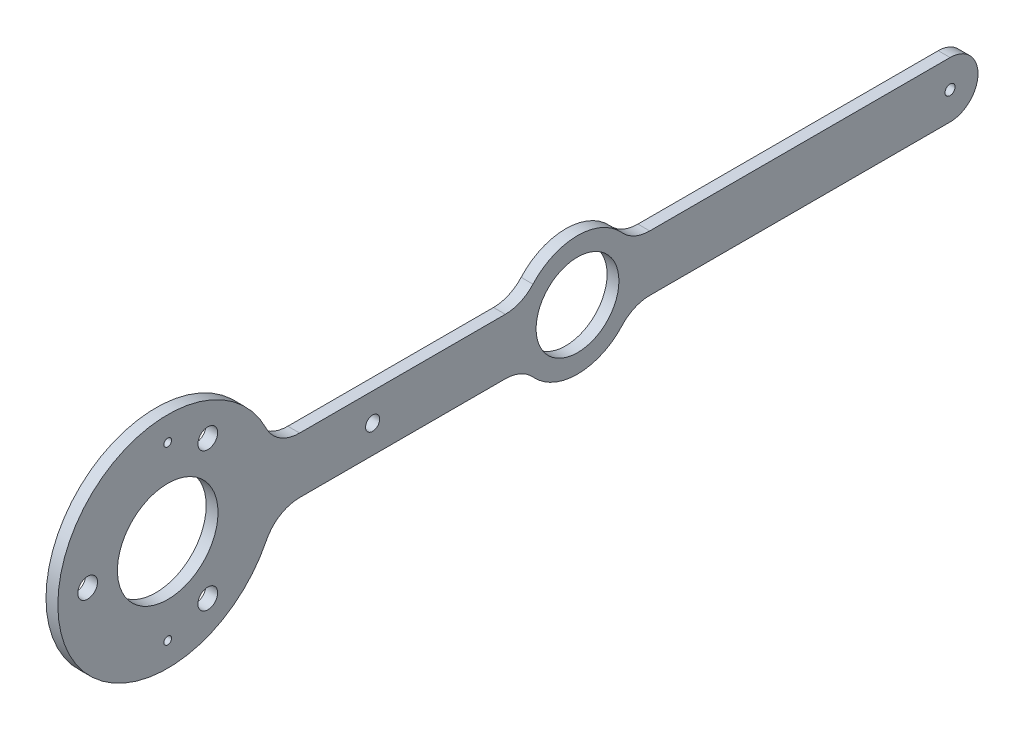
ISO-10303-21;
HEADER;
FILE_DESCRIPTION(('STEP AP214'),'2;1');
FILE_NAME('part.step','',(''),(''),'','','');
FILE_SCHEMA(('AUTOMOTIVE_DESIGN { 1 0 10303 214 1 1 1 1 }'));
ENDSEC;
DATA;
#1=APPLICATION_CONTEXT('core data for automotive mechanical design processes');
#2=APPLICATION_PROTOCOL_DEFINITION('international standard','automotive_design',2000,#1);
#3=PRODUCT_CONTEXT('',#1,'mechanical');
#4=PRODUCT('Part','Part','',(#3));
#5=PRODUCT_RELATED_PRODUCT_CATEGORY('part','',(#4));
#6=PRODUCT_DEFINITION_FORMATION('','',#4);
#7=PRODUCT_DEFINITION_CONTEXT('part definition',#1,'design');
#8=PRODUCT_DEFINITION('design','',#6,#7);
#9=PRODUCT_DEFINITION_SHAPE('','',#8);
#10=(LENGTH_UNIT() NAMED_UNIT(*) SI_UNIT(.MILLI.,.METRE.));
#11=(NAMED_UNIT(*) PLANE_ANGLE_UNIT() SI_UNIT($,.RADIAN.));
#12=(NAMED_UNIT(*) SI_UNIT($,.STERADIAN.) SOLID_ANGLE_UNIT());
#13=UNCERTAINTY_MEASURE_WITH_UNIT(LENGTH_MEASURE(1.E-05),#10,'distance_accuracy_value','');
#14=(GEOMETRIC_REPRESENTATION_CONTEXT(3) GLOBAL_UNCERTAINTY_ASSIGNED_CONTEXT((#13)) GLOBAL_UNIT_ASSIGNED_CONTEXT((#10,
#11,#12)) REPRESENTATION_CONTEXT('',''));
#15=CARTESIAN_POINT('',(0.,0.,0.));
#16=DIRECTION('',(0.,0.,1.));
#17=DIRECTION('',(1.,0.,0.));
#18=AXIS2_PLACEMENT_3D('',#15,#16,#17);
#19=CARTESIAN_POINT('',(3.175,0.,110.));
#20=DIRECTION('',(-1.,0.,0.));
#21=DIRECTION('',(0.,0.,1.));
#22=AXIS2_PLACEMENT_3D('',#19,#20,#21);
#23=CYLINDRICAL_SURFACE('',#22,29.5);
#24=CARTESIAN_POINT('',(3.175,0.,110.));
#25=DIRECTION('',(1.,0.,0.));
#26=DIRECTION('',(0.,0.,-1.));
#27=AXIS2_PLACEMENT_3D('',#24,#25,#26);
#28=CIRCLE('',#27,29.5);
#29=CARTESIAN_POINT('',(3.175,13.0696202531646,83.5531660413185));
#30=VERTEX_POINT('',#29);
#31=CARTESIAN_POINT('',(3.175,-13.0696202531646,83.5531660413185));
#32=VERTEX_POINT('',#31);
#33=EDGE_CURVE('E232',#30,#32,#28,.T.);
#34=ORIENTED_EDGE('',*,*,#33,.F.);
#35=DIRECTION('',(-1.,0.,0.));
#36=VECTOR('',#35,1.);
#37=CARTESIAN_POINT('',(3.175,13.0696202531646,83.5531660413185));
#38=LINE('',#37,#36);
#39=CARTESIAN_POINT('',(0.,13.0696202531646,83.5531660413185));
#40=VERTEX_POINT('',#39);
#41=EDGE_CURVE('E235',#30,#40,#38,.T.);
#42=ORIENTED_EDGE('',*,*,#41,.T.);
#43=CARTESIAN_POINT('',(0.,0.,110.));
#44=DIRECTION('',(1.,0.,0.));
#45=DIRECTION('',(0.,0.,-1.));
#46=AXIS2_PLACEMENT_3D('',#43,#44,#45);
#47=CIRCLE('',#46,29.5);
#48=CARTESIAN_POINT('',(0.,-13.0696202531646,83.5531660413185));
#49=VERTEX_POINT('',#48);
#50=EDGE_CURVE('E196',#40,#49,#47,.T.);
#51=ORIENTED_EDGE('',*,*,#50,.T.);
#52=DIRECTION('',(-1.,0.,0.));
#53=VECTOR('',#52,1.);
#54=CARTESIAN_POINT('',(3.175,-13.0696202531646,83.5531660413185));
#55=LINE('',#54,#53);
#56=EDGE_CURVE('E164',#49,#32,#55,.F.);
#57=ORIENTED_EDGE('',*,*,#56,.T.);
#58=EDGE_LOOP('',(#34,#42,#51,#57));
#59=FACE_BOUND('',#58,.T.);
#60=ADVANCED_FACE('F41',(#59),#23,.T.);
#61=CARTESIAN_POINT('',(3.175,-7.5,0.));
#62=DIRECTION('',(0.,1.,0.));
#63=DIRECTION('',(0.,0.,1.));
#64=AXIS2_PLACEMENT_3D('',#61,#62,#63);
#65=PLANE('',#64);
#66=DIRECTION('',(0.,0.,-1.));
#67=VECTOR('',#66,1.);
#68=CARTESIAN_POINT('',(3.175,-7.5,0.));
#69=LINE('',#68,#67);
#70=CARTESIAN_POINT('',(3.175,-7.5,74.5881375807485));
#71=VERTEX_POINT('',#70);
#72=CARTESIAN_POINT('',(3.175,-7.5,19.3807289917072));
#73=VERTEX_POINT('',#72);
#74=EDGE_CURVE('E302',#71,#73,#69,.T.);
#75=ORIENTED_EDGE('',*,*,#74,.F.);
#76=DIRECTION('',(1.,0.,0.));
#77=VECTOR('',#76,1.);
#78=CARTESIAN_POINT('',(0.,-7.5,74.5881375807485));
#79=LINE('',#78,#77);
#80=CARTESIAN_POINT('',(0.,-7.5,74.5881375807485));
#81=VERTEX_POINT('',#80);
#82=EDGE_CURVE('E245',#71,#81,#79,.F.);
#83=ORIENTED_EDGE('',*,*,#82,.T.);
#84=DIRECTION('',(0.,0.,-1.));
#85=VECTOR('',#84,1.);
#86=CARTESIAN_POINT('',(0.,-7.5,0.));
#87=LINE('',#86,#85);
#88=CARTESIAN_POINT('',(0.,-7.5,19.3807289917072));
#89=VERTEX_POINT('',#88);
#90=EDGE_CURVE('E199',#81,#89,#87,.T.);
#91=ORIENTED_EDGE('',*,*,#90,.T.);
#92=DIRECTION('',(1.,0.,0.));
#93=VECTOR('',#92,1.);
#94=CARTESIAN_POINT('',(3.175,-7.5,19.3807289917072));
#95=LINE('',#94,#93);
#96=EDGE_CURVE('E243',#89,#73,#95,.T.);
#97=ORIENTED_EDGE('',*,*,#96,.T.);
#98=EDGE_LOOP('',(#75,#83,#91,#97));
#99=FACE_BOUND('',#98,.T.);
#100=ADVANCED_FACE('F328',(#99),#65,.F.);
#101=CARTESIAN_POINT('',(3.175,0.,0.));
#102=DIRECTION('',(-1.,0.,0.));
#103=DIRECTION('',(0.,0.,1.));
#104=AXIS2_PLACEMENT_3D('',#101,#102,#103);
#105=CYLINDRICAL_SURFACE('',#104,16.1125);
#106=CARTESIAN_POINT('',(3.175,0.,0.));
#107=DIRECTION('',(1.,0.,0.));
#108=DIRECTION('',(0.,0.,-1.));
#109=AXIS2_PLACEMENT_3D('',#106,#107,#108);
#110=CIRCLE('',#109,16.1125);
#111=CARTESIAN_POINT('',(3.175,-10.7982288176161,11.9587169316949));
#112=VERTEX_POINT('',#111);
#113=CARTESIAN_POINT('',(3.175,-10.7982288176161,-11.9587169316949));
#114=VERTEX_POINT('',#113);
#115=EDGE_CURVE('E154',#112,#114,#110,.T.);
#116=ORIENTED_EDGE('',*,*,#115,.F.);
#117=DIRECTION('',(-1.,0.,0.));
#118=VECTOR('',#117,1.);
#119=CARTESIAN_POINT('',(3.175,-10.7982288176161,11.9587169316949));
#120=LINE('',#119,#118);
#121=CARTESIAN_POINT('',(0.,-10.7982288176161,11.9587169316949));
#122=VERTEX_POINT('',#121);
#123=EDGE_CURVE('E250',#112,#122,#120,.T.);
#124=ORIENTED_EDGE('',*,*,#123,.T.);
#125=CARTESIAN_POINT('',(0.,0.,0.));
#126=DIRECTION('',(1.,0.,0.));
#127=DIRECTION('',(0.,0.,-1.));
#128=AXIS2_PLACEMENT_3D('',#125,#126,#127);
#129=CIRCLE('',#128,16.1125);
#130=CARTESIAN_POINT('',(0.,-10.7982288176161,-11.9587169316949));
#131=VERTEX_POINT('',#130);
#132=EDGE_CURVE('E203',#122,#131,#129,.T.);
#133=ORIENTED_EDGE('',*,*,#132,.T.);
#134=DIRECTION('',(-1.,0.,0.));
#135=VECTOR('',#134,1.);
#136=CARTESIAN_POINT('',(3.175,-10.7982288176161,-11.9587169316949));
#137=LINE('',#136,#135);
#138=EDGE_CURVE('E248',#131,#114,#137,.F.);
#139=ORIENTED_EDGE('',*,*,#138,.T.);
#140=EDGE_LOOP('',(#116,#124,#133,#139));
#141=FACE_BOUND('',#140,.T.);
#142=ADVANCED_FACE('F333',(#141),#105,.T.);
#143=CARTESIAN_POINT('',(3.175,-7.50000000000001,0.));
#144=DIRECTION('',(0.,1.,0.));
#145=DIRECTION('',(0.,0.,1.));
#146=AXIS2_PLACEMENT_3D('',#143,#144,#145);
#147=PLANE('',#146);
#148=DIRECTION('',(0.,0.,-1.));
#149=VECTOR('',#148,1.);
#150=CARTESIAN_POINT('',(3.175,-7.50000000000001,0.));
#151=LINE('',#150,#149);
#152=CARTESIAN_POINT('',(3.175,-7.5,-19.3807289917072));
#153=VERTEX_POINT('',#152);
#154=CARTESIAN_POINT('',(3.175,-7.49999999999996,-100.));
#155=VERTEX_POINT('',#154);
#156=EDGE_CURVE('E141',#153,#155,#151,.T.);
#157=ORIENTED_EDGE('',*,*,#156,.F.);
#158=DIRECTION('',(1.,0.,0.));
#159=VECTOR('',#158,1.);
#160=CARTESIAN_POINT('',(0.,-7.5,-19.3807289917072));
#161=LINE('',#160,#159);
#162=CARTESIAN_POINT('',(0.,-7.5,-19.3807289917072));
#163=VERTEX_POINT('',#162);
#164=EDGE_CURVE('E253',#153,#163,#161,.F.);
#165=ORIENTED_EDGE('',*,*,#164,.T.);
#166=DIRECTION('',(0.,0.,-1.));
#167=VECTOR('',#166,1.);
#168=CARTESIAN_POINT('',(0.,-7.50000000000001,0.));
#169=LINE('',#168,#167);
#170=CARTESIAN_POINT('',(0.,-7.49999999999996,-100.));
#171=VERTEX_POINT('',#170);
#172=EDGE_CURVE('E160',#163,#171,#169,.T.);
#173=ORIENTED_EDGE('',*,*,#172,.T.);
#174=DIRECTION('',(-1.,0.,0.));
#175=VECTOR('',#174,1.);
#176=CARTESIAN_POINT('',(3.175,-7.49999999999996,-100.));
#177=LINE('',#176,#175);
#178=EDGE_CURVE('E157',#155,#171,#177,.T.);
#179=ORIENTED_EDGE('',*,*,#178,.F.);
#180=EDGE_LOOP('',(#157,#165,#173,#179));
#181=FACE_BOUND('',#180,.T.);
#182=ADVANCED_FACE('F158',(#181),#147,.F.);
#183=CARTESIAN_POINT('',(3.175,0.,-100.));
#184=DIRECTION('',(-1.,0.,0.));
#185=DIRECTION('',(0.,0.,1.));
#186=AXIS2_PLACEMENT_3D('',#183,#184,#185);
#187=CYLINDRICAL_SURFACE('',#186,7.5);
#188=CARTESIAN_POINT('',(0.,0.,-100.));
#189=DIRECTION('',(1.,0.,0.));
#190=DIRECTION('',(0.,0.,-1.));
#191=AXIS2_PLACEMENT_3D('',#188,#189,#190);
#192=CIRCLE('',#191,7.5);
#193=CARTESIAN_POINT('',(0.,7.50000000000004,-100.));
#194=VERTEX_POINT('',#193);
#195=EDGE_CURVE('E207',#194,#171,#192,.F.);
#196=ORIENTED_EDGE('',*,*,#195,.F.);
#197=DIRECTION('',(-1.,0.,0.));
#198=VECTOR('',#197,1.);
#199=CARTESIAN_POINT('',(3.175,7.50000000000004,-100.));
#200=LINE('',#199,#198);
#201=CARTESIAN_POINT('',(3.175,7.50000000000004,-100.));
#202=VERTEX_POINT('',#201);
#203=EDGE_CURVE('E165',#202,#194,#200,.T.);
#204=ORIENTED_EDGE('',*,*,#203,.F.);
#205=CARTESIAN_POINT('',(3.175,0.,-100.));
#206=DIRECTION('',(1.,0.,0.));
#207=DIRECTION('',(0.,0.,-1.));
#208=AXIS2_PLACEMENT_3D('',#205,#206,#207);
#209=CIRCLE('',#208,7.5);
#210=EDGE_CURVE('E147',#202,#155,#209,.F.);
#211=ORIENTED_EDGE('',*,*,#210,.T.);
#212=ORIENTED_EDGE('',*,*,#178,.T.);
#213=EDGE_LOOP('',(#196,#204,#211,#212));
#214=FACE_BOUND('',#213,.T.);
#215=ADVANCED_FACE('F168',(#214),#187,.T.);
#216=CARTESIAN_POINT('',(3.175,7.49999999999999,0.));
#217=DIRECTION('',(0.,1.,0.));
#218=DIRECTION('',(0.,0.,1.));
#219=AXIS2_PLACEMENT_3D('',#216,#217,#218);
#220=PLANE('',#219);
#221=DIRECTION('',(0.,0.,-1.));
#222=VECTOR('',#221,1.);
#223=CARTESIAN_POINT('',(0.,7.49999999999999,0.));
#224=LINE('',#223,#222);
#225=CARTESIAN_POINT('',(0.,7.5,-19.3807289917072));
#226=VERTEX_POINT('',#225);
#227=EDGE_CURVE('E209',#226,#194,#224,.T.);
#228=ORIENTED_EDGE('',*,*,#227,.F.);
#229=DIRECTION('',(-1.,0.,0.));
#230=VECTOR('',#229,1.);
#231=CARTESIAN_POINT('',(3.175,7.5,-19.3807289917072));
#232=LINE('',#231,#230);
#233=CARTESIAN_POINT('',(3.175,7.5,-19.3807289917072));
#234=VERTEX_POINT('',#233);
#235=EDGE_CURVE('E56',#226,#234,#232,.F.);
#236=ORIENTED_EDGE('',*,*,#235,.T.);
#237=DIRECTION('',(0.,0.,-1.));
#238=VECTOR('',#237,1.);
#239=CARTESIAN_POINT('',(3.175,7.49999999999999,0.));
#240=LINE('',#239,#238);
#241=EDGE_CURVE('E170',#234,#202,#240,.T.);
#242=ORIENTED_EDGE('',*,*,#241,.T.);
#243=ORIENTED_EDGE('',*,*,#203,.T.);
#244=EDGE_LOOP('',(#228,#236,#242,#243));
#245=FACE_BOUND('',#244,.T.);
#246=ADVANCED_FACE('F316',(#245),#220,.T.);
#247=CARTESIAN_POINT('',(3.175,0.,0.));
#248=DIRECTION('',(-1.,0.,0.));
#249=DIRECTION('',(0.,0.,1.));
#250=AXIS2_PLACEMENT_3D('',#247,#248,#249);
#251=CYLINDRICAL_SURFACE('',#250,16.1125);
#252=CARTESIAN_POINT('',(3.175,0.,0.));
#253=DIRECTION('',(1.,0.,0.));
#254=DIRECTION('',(0.,0.,-1.));
#255=AXIS2_PLACEMENT_3D('',#252,#253,#254);
#256=CIRCLE('',#255,16.1125);
#257=CARTESIAN_POINT('',(3.175,10.7982288176161,-11.9587169316949));
#258=VERTEX_POINT('',#257);
#259=CARTESIAN_POINT('',(3.175,10.7982288176161,11.9587169316949));
#260=VERTEX_POINT('',#259);
#261=EDGE_CURVE('E172',#258,#260,#256,.T.);
#262=ORIENTED_EDGE('',*,*,#261,.F.);
#263=DIRECTION('',(-1.,0.,0.));
#264=VECTOR('',#263,1.);
#265=CARTESIAN_POINT('',(3.175,10.7982288176161,-11.9587169316949));
#266=LINE('',#265,#264);
#267=CARTESIAN_POINT('',(0.,10.7982288176161,-11.9587169316949));
#268=VERTEX_POINT('',#267);
#269=EDGE_CURVE('E257',#258,#268,#266,.T.);
#270=ORIENTED_EDGE('',*,*,#269,.T.);
#271=CARTESIAN_POINT('',(0.,0.,0.));
#272=DIRECTION('',(1.,0.,0.));
#273=DIRECTION('',(0.,0.,-1.));
#274=AXIS2_PLACEMENT_3D('',#271,#272,#273);
#275=CIRCLE('',#274,16.1125);
#276=CARTESIAN_POINT('',(0.,10.7982288176161,11.9587169316949));
#277=VERTEX_POINT('',#276);
#278=EDGE_CURVE('E211',#268,#277,#275,.T.);
#279=ORIENTED_EDGE('',*,*,#278,.T.);
#280=DIRECTION('',(-1.,0.,0.));
#281=VECTOR('',#280,1.);
#282=CARTESIAN_POINT('',(3.175,10.7982288176161,11.9587169316949));
#283=LINE('',#282,#281);
#284=EDGE_CURVE('E255',#277,#260,#283,.F.);
#285=ORIENTED_EDGE('',*,*,#284,.T.);
#286=EDGE_LOOP('',(#262,#270,#279,#285));
#287=FACE_BOUND('',#286,.T.);
#288=ADVANCED_FACE('F287',(#287),#251,.T.);
#289=CARTESIAN_POINT('',(3.175,-1.90914435981862E-13,131.5));
#290=DIRECTION('',(-1.,0.,0.));
#291=DIRECTION('',(0.,0.,1.));
#292=AXIS2_PLACEMENT_3D('',#289,#290,#291);
#293=CYLINDRICAL_SURFACE('',#292,2.65000000000007);
#294=CARTESIAN_POINT('',(3.175,-1.90914435981862E-13,131.5));
#295=DIRECTION('',(1.,0.,0.));
#296=DIRECTION('',(0.,0.,-1.));
#297=AXIS2_PLACEMENT_3D('',#294,#295,#296);
#298=CIRCLE('',#297,2.65000000000007);
#299=CARTESIAN_POINT('',(3.175,-1.90914435981862E-13,128.85));
#300=VERTEX_POINT('',#299);
#301=EDGE_CURVE('E190',#300,#300,#298,.T.);
#302=ORIENTED_EDGE('',*,*,#301,.T.);
#303=EDGE_LOOP('',(#302));
#304=FACE_BOUND('',#303,.T.);
#305=CARTESIAN_POINT('',(0.,-1.90914435981862E-13,131.5));
#306=DIRECTION('',(1.,0.,0.));
#307=DIRECTION('',(0.,0.,-1.));
#308=AXIS2_PLACEMENT_3D('',#305,#306,#307);
#309=CIRCLE('',#308,2.65000000000007);
#310=CARTESIAN_POINT('',(0.,-1.90914435981862E-13,128.85));
#311=VERTEX_POINT('',#310);
#312=EDGE_CURVE('E226',#311,#311,#309,.T.);
#313=ORIENTED_EDGE('',*,*,#312,.F.);
#314=EDGE_LOOP('',(#313));
#315=FACE_BOUND('',#314,.T.);
#316=ADVANCED_FACE('F365',(#304,#315),#293,.F.);
#317=CARTESIAN_POINT('',(3.175,18.6195461813655,99.2500000000002));
#318=DIRECTION('',(-1.,0.,0.));
#319=DIRECTION('',(0.,0.,1.));
#320=AXIS2_PLACEMENT_3D('',#317,#318,#319);
#321=CYLINDRICAL_SURFACE('',#320,2.65000000000004);
#322=CARTESIAN_POINT('',(3.175,18.6195461813655,99.2500000000002));
#323=DIRECTION('',(1.,0.,0.));
#324=DIRECTION('',(0.,0.,-1.));
#325=AXIS2_PLACEMENT_3D('',#322,#323,#324);
#326=CIRCLE('',#325,2.65000000000004);
#327=CARTESIAN_POINT('',(3.175,18.6195461813655,96.6000000000002));
#328=VERTEX_POINT('',#327);
#329=EDGE_CURVE('E187',#328,#328,#326,.T.);
#330=ORIENTED_EDGE('',*,*,#329,.T.);
#331=EDGE_LOOP('',(#330));
#332=FACE_BOUND('',#331,.T.);
#333=CARTESIAN_POINT('',(0.,18.6195461813655,99.2500000000002));
#334=DIRECTION('',(1.,0.,0.));
#335=DIRECTION('',(0.,0.,-1.));
#336=AXIS2_PLACEMENT_3D('',#333,#334,#335);
#337=CIRCLE('',#336,2.65000000000004);
#338=CARTESIAN_POINT('',(0.,18.6195461813655,96.6000000000002));
#339=VERTEX_POINT('',#338);
#340=EDGE_CURVE('E223',#339,#339,#337,.T.);
#341=ORIENTED_EDGE('',*,*,#340,.F.);
#342=EDGE_LOOP('',(#341));
#343=FACE_BOUND('',#342,.T.);
#344=ADVANCED_FACE('F376',(#332,#343),#321,.F.);
#345=CARTESIAN_POINT('',(3.175,0.,110.));
#346=DIRECTION('',(-1.,0.,0.));
#347=DIRECTION('',(0.,0.,1.));
#348=AXIS2_PLACEMENT_3D('',#345,#346,#347);
#349=CYLINDRICAL_SURFACE('',#348,13.5);
#350=CARTESIAN_POINT('',(3.175,0.,110.));
#351=DIRECTION('',(1.,0.,0.));
#352=DIRECTION('',(0.,0.,-1.));
#353=AXIS2_PLACEMENT_3D('',#350,#351,#352);
#354=CIRCLE('',#353,13.5);
#355=CARTESIAN_POINT('',(3.175,0.,96.5));
#356=VERTEX_POINT('',#355);
#357=EDGE_CURVE('E184',#356,#356,#354,.T.);
#358=ORIENTED_EDGE('',*,*,#357,.T.);
#359=EDGE_LOOP('',(#358));
#360=FACE_BOUND('',#359,.T.);
#361=CARTESIAN_POINT('',(0.,0.,110.));
#362=DIRECTION('',(1.,0.,0.));
#363=DIRECTION('',(0.,0.,-1.));
#364=AXIS2_PLACEMENT_3D('',#361,#362,#363);
#365=CIRCLE('',#364,13.5);
#366=CARTESIAN_POINT('',(0.,0.,96.5));
#367=VERTEX_POINT('',#366);
#368=EDGE_CURVE('E220',#367,#367,#365,.T.);
#369=ORIENTED_EDGE('',*,*,#368,.F.);
#370=EDGE_LOOP('',(#369));
#371=FACE_BOUND('',#370,.T.);
#372=ADVANCED_FACE('F372',(#360,#371),#349,.F.);
#373=CARTESIAN_POINT('',(3.175,0.,0.));
#374=DIRECTION('',(-1.,0.,0.));
#375=DIRECTION('',(0.,0.,1.));
#376=AXIS2_PLACEMENT_3D('',#373,#374,#375);
#377=CYLINDRICAL_SURFACE('',#376,11.1125);
#378=CARTESIAN_POINT('',(3.175,0.,0.));
#379=DIRECTION('',(1.,0.,0.));
#380=DIRECTION('',(0.,0.,-1.));
#381=AXIS2_PLACEMENT_3D('',#378,#379,#380);
#382=CIRCLE('',#381,11.1125);
#383=CARTESIAN_POINT('',(3.175,0.,-11.1125));
#384=VERTEX_POINT('',#383);
#385=EDGE_CURVE('E181',#384,#384,#382,.T.);
#386=ORIENTED_EDGE('',*,*,#385,.T.);
#387=EDGE_LOOP('',(#386));
#388=FACE_BOUND('',#387,.T.);
#389=CARTESIAN_POINT('',(0.,0.,0.));
#390=DIRECTION('',(1.,0.,0.));
#391=DIRECTION('',(0.,0.,-1.));
#392=AXIS2_PLACEMENT_3D('',#389,#390,#391);
#393=CIRCLE('',#392,11.1125);
#394=CARTESIAN_POINT('',(0.,0.,-11.1125));
#395=VERTEX_POINT('',#394);
#396=EDGE_CURVE('E217',#395,#395,#393,.T.);
#397=ORIENTED_EDGE('',*,*,#396,.F.);
#398=EDGE_LOOP('',(#397));
#399=FACE_BOUND('',#398,.T.);
#400=ADVANCED_FACE('F369',(#388,#399),#377,.F.);
#401=CARTESIAN_POINT('',(3.175,7.5,0.));
#402=DIRECTION('',(0.,1.,0.));
#403=DIRECTION('',(0.,0.,1.));
#404=AXIS2_PLACEMENT_3D('',#401,#402,#403);
#405=PLANE('',#404);
#406=DIRECTION('',(0.,0.,-1.));
#407=VECTOR('',#406,1.);
#408=CARTESIAN_POINT('',(0.,7.5,0.));
#409=LINE('',#408,#407);
#410=CARTESIAN_POINT('',(0.,7.5,74.5881375807485));
#411=VERTEX_POINT('',#410);
#412=CARTESIAN_POINT('',(0.,7.5,19.3807289917072));
#413=VERTEX_POINT('',#412);
#414=EDGE_CURVE('E214',#411,#413,#409,.T.);
#415=ORIENTED_EDGE('',*,*,#414,.F.);
#416=DIRECTION('',(-1.,0.,0.));
#417=VECTOR('',#416,1.);
#418=CARTESIAN_POINT('',(3.175,7.5,74.5881375807485));
#419=LINE('',#418,#417);
#420=CARTESIAN_POINT('',(3.175,7.5,74.5881375807485));
#421=VERTEX_POINT('',#420);
#422=EDGE_CURVE('E241',#411,#421,#419,.F.);
#423=ORIENTED_EDGE('',*,*,#422,.T.);
#424=DIRECTION('',(0.,0.,-1.));
#425=VECTOR('',#424,1.);
#426=CARTESIAN_POINT('',(3.175,7.5,0.));
#427=LINE('',#426,#425);
#428=CARTESIAN_POINT('',(3.175,7.5,19.3807289917072));
#429=VERTEX_POINT('',#428);
#430=EDGE_CURVE('E178',#421,#429,#427,.T.);
#431=ORIENTED_EDGE('',*,*,#430,.T.);
#432=DIRECTION('',(-1.,0.,0.));
#433=VECTOR('',#432,1.);
#434=CARTESIAN_POINT('',(3.175,7.5,19.3807289917072));
#435=LINE('',#434,#433);
#436=EDGE_CURVE('E238',#429,#413,#435,.T.);
#437=ORIENTED_EDGE('',*,*,#436,.T.);
#438=EDGE_LOOP('',(#415,#423,#431,#437));
#439=FACE_BOUND('',#438,.T.);
#440=ADVANCED_FACE('F292',(#439),#405,.T.);
#441=CARTESIAN_POINT('',(3.175,-18.6195461813653,99.2499999999998));
#442=DIRECTION('',(-1.,0.,0.));
#443=DIRECTION('',(0.,0.,1.));
#444=AXIS2_PLACEMENT_3D('',#441,#442,#443);
#445=CYLINDRICAL_SURFACE('',#444,2.64999999999999);
#446=CARTESIAN_POINT('',(3.175,-18.6195461813653,99.2499999999998));
#447=DIRECTION('',(1.,0.,0.));
#448=DIRECTION('',(0.,0.,-1.));
#449=AXIS2_PLACEMENT_3D('',#446,#447,#448);
#450=CIRCLE('',#449,2.64999999999999);
#451=CARTESIAN_POINT('',(3.175,-18.6195461813653,96.5999999999998));
#452=VERTEX_POINT('',#451);
#453=EDGE_CURVE('E193',#452,#452,#450,.T.);
#454=ORIENTED_EDGE('',*,*,#453,.T.);
#455=EDGE_LOOP('',(#454));
#456=FACE_BOUND('',#455,.T.);
#457=CARTESIAN_POINT('',(0.,-18.6195461813653,99.2499999999998));
#458=DIRECTION('',(1.,0.,0.));
#459=DIRECTION('',(0.,0.,-1.));
#460=AXIS2_PLACEMENT_3D('',#457,#458,#459);
#461=CIRCLE('',#460,2.64999999999999);
#462=CARTESIAN_POINT('',(0.,-18.6195461813653,96.5999999999998));
#463=VERTEX_POINT('',#462);
#464=EDGE_CURVE('E229',#463,#463,#461,.T.);
#465=ORIENTED_EDGE('',*,*,#464,.F.);
#466=EDGE_LOOP('',(#465));
#467=FACE_BOUND('',#466,.T.);
#468=ADVANCED_FACE('F368',(#456,#467),#445,.F.);
#469=CARTESIAN_POINT('',(3.175,0.,0.));
#470=DIRECTION('',(1.,0.,0.));
#471=DIRECTION('',(0.,0.,-1.));
#472=AXIS2_PLACEMENT_3D('',#469,#470,#471);
#473=PLANE('',#472);
#474=CARTESIAN_POINT('',(3.175,0.,-100.));
#475=DIRECTION('',(1.,0.,0.));
#476=DIRECTION('',(0.,0.,-1.));
#477=AXIS2_PLACEMENT_3D('',#474,#475,#476);
#478=CIRCLE('',#477,1.35254999999999);
#479=CARTESIAN_POINT('',(3.175,0.,-101.35255));
#480=VERTEX_POINT('',#479);
#481=EDGE_CURVE('E415',#480,#480,#478,.T.);
#482=ORIENTED_EDGE('',*,*,#481,.F.);
#483=EDGE_LOOP('',(#482));
#484=FACE_BOUND('',#483,.T.);
#485=CARTESIAN_POINT('',(3.175,0.,55.));
#486=DIRECTION('',(1.,0.,0.));
#487=DIRECTION('',(0.,0.,-1.));
#488=AXIS2_PLACEMENT_3D('',#485,#486,#487);
#489=CIRCLE('',#488,1.89864999999999);
#490=CARTESIAN_POINT('',(3.175,0.,53.10135));
#491=VERTEX_POINT('',#490);
#492=EDGE_CURVE('E417',#491,#491,#489,.T.);
#493=ORIENTED_EDGE('',*,*,#492,.F.);
#494=EDGE_LOOP('',(#493));
#495=FACE_BOUND('',#494,.T.);
#496=CARTESIAN_POINT('',(3.175,23.015,110.));
#497=DIRECTION('',(1.,0.,0.));
#498=DIRECTION('',(0.,0.,-1.));
#499=AXIS2_PLACEMENT_3D('',#496,#497,#498);
#500=CIRCLE('',#499,1.02499999999999);
#501=CARTESIAN_POINT('',(3.175,23.015,108.975));
#502=VERTEX_POINT('',#501);
#503=EDGE_CURVE('E425',#502,#502,#500,.T.);
#504=ORIENTED_EDGE('',*,*,#503,.F.);
#505=EDGE_LOOP('',(#504));
#506=FACE_BOUND('',#505,.T.);
#507=CARTESIAN_POINT('',(3.175,-23.015,110.));
#508=DIRECTION('',(1.,0.,0.));
#509=DIRECTION('',(0.,0.,-1.));
#510=AXIS2_PLACEMENT_3D('',#507,#508,#509);
#511=CIRCLE('',#510,1.02499999999999);
#512=CARTESIAN_POINT('',(3.175,-23.015,108.975));
#513=VERTEX_POINT('',#512);
#514=EDGE_CURVE('E430',#513,#513,#511,.T.);
#515=ORIENTED_EDGE('',*,*,#514,.F.);
#516=EDGE_LOOP('',(#515));
#517=FACE_BOUND('',#516,.T.);
#518=ORIENTED_EDGE('',*,*,#430,.F.);
#519=CARTESIAN_POINT('',(3.175,17.5,74.5881375807485));
#520=DIRECTION('',(1.,0.,0.));
#521=DIRECTION('',(0.,0.,-1.));
#522=AXIS2_PLACEMENT_3D('',#519,#520,#521);
#523=CIRCLE('',#522,10.);
#524=EDGE_CURVE('E263',#421,#30,#523,.F.);
#525=ORIENTED_EDGE('',*,*,#524,.T.);
#526=ORIENTED_EDGE('',*,*,#33,.T.);
#527=CARTESIAN_POINT('',(3.175,-17.5,74.5881375807485));
#528=DIRECTION('',(1.,0.,0.));
#529=DIRECTION('',(0.,0.,-1.));
#530=AXIS2_PLACEMENT_3D('',#527,#528,#529);
#531=CIRCLE('',#530,10.);
#532=EDGE_CURVE('E267',#32,#71,#531,.F.);
#533=ORIENTED_EDGE('',*,*,#532,.T.);
#534=ORIENTED_EDGE('',*,*,#74,.T.);
#535=CARTESIAN_POINT('',(3.175,-17.5,19.3807289917072));
#536=DIRECTION('',(1.,0.,0.));
#537=DIRECTION('',(0.,0.,-1.));
#538=AXIS2_PLACEMENT_3D('',#535,#536,#537);
#539=CIRCLE('',#538,10.);
#540=EDGE_CURVE('E271',#73,#112,#539,.F.);
#541=ORIENTED_EDGE('',*,*,#540,.T.);
#542=ORIENTED_EDGE('',*,*,#115,.T.);
#543=CARTESIAN_POINT('',(3.175,-17.5,-19.3807289917072));
#544=DIRECTION('',(1.,0.,0.));
#545=DIRECTION('',(0.,0.,-1.));
#546=AXIS2_PLACEMENT_3D('',#543,#544,#545);
#547=CIRCLE('',#546,10.);
#548=EDGE_CURVE('E150',#114,#153,#547,.F.);
#549=ORIENTED_EDGE('',*,*,#548,.T.);
#550=ORIENTED_EDGE('',*,*,#156,.T.);
#551=ORIENTED_EDGE('',*,*,#210,.F.);
#552=ORIENTED_EDGE('',*,*,#241,.F.);
#553=CARTESIAN_POINT('',(3.175,17.5,-19.3807289917072));
#554=DIRECTION('',(1.,0.,0.));
#555=DIRECTION('',(0.,0.,-1.));
#556=AXIS2_PLACEMENT_3D('',#553,#554,#555);
#557=CIRCLE('',#556,10.);
#558=EDGE_CURVE('E277',#234,#258,#557,.F.);
#559=ORIENTED_EDGE('',*,*,#558,.T.);
#560=ORIENTED_EDGE('',*,*,#261,.T.);
#561=CARTESIAN_POINT('',(3.175,17.5,19.3807289917072));
#562=DIRECTION('',(1.,0.,0.));
#563=DIRECTION('',(0.,0.,-1.));
#564=AXIS2_PLACEMENT_3D('',#561,#562,#563);
#565=CIRCLE('',#564,10.);
#566=EDGE_CURVE('E11',#260,#429,#565,.F.);
#567=ORIENTED_EDGE('',*,*,#566,.T.);
#568=EDGE_LOOP('',(#518,#525,#526,#533,#534,#541,#542,#549,#550,#551,#552,#559,#560,#567));
#569=FACE_BOUND('',#568,.T.);
#570=ORIENTED_EDGE('',*,*,#385,.F.);
#571=EDGE_LOOP('',(#570));
#572=FACE_BOUND('',#571,.T.);
#573=ORIENTED_EDGE('',*,*,#357,.F.);
#574=EDGE_LOOP('',(#573));
#575=FACE_BOUND('',#574,.T.);
#576=ORIENTED_EDGE('',*,*,#329,.F.);
#577=EDGE_LOOP('',(#576));
#578=FACE_BOUND('',#577,.T.);
#579=ORIENTED_EDGE('',*,*,#301,.F.);
#580=EDGE_LOOP('',(#579));
#581=FACE_BOUND('',#580,.T.);
#582=ORIENTED_EDGE('',*,*,#453,.F.);
#583=EDGE_LOOP('',(#582));
#584=FACE_BOUND('',#583,.T.);
#585=ADVANCED_FACE('F144',(#484,#495,#506,#517,#569,#572,#575,#578,#581,#584),#473,.T.);
#586=CARTESIAN_POINT('',(0.,0.,0.));
#587=DIRECTION('',(1.,0.,0.));
#588=DIRECTION('',(0.,0.,-1.));
#589=AXIS2_PLACEMENT_3D('',#586,#587,#588);
#590=PLANE('',#589);
#591=CARTESIAN_POINT('',(0.,0.,-100.));
#592=DIRECTION('',(1.,0.,0.));
#593=DIRECTION('',(0.,0.,-1.));
#594=AXIS2_PLACEMENT_3D('',#591,#592,#593);
#595=CIRCLE('',#594,1.35254999999999);
#596=CARTESIAN_POINT('',(0.,0.,-101.35255));
#597=VERTEX_POINT('',#596);
#598=EDGE_CURVE('E412',#597,#597,#595,.T.);
#599=ORIENTED_EDGE('',*,*,#598,.T.);
#600=EDGE_LOOP('',(#599));
#601=FACE_BOUND('',#600,.T.);
#602=CARTESIAN_POINT('',(0.,0.,55.));
#603=DIRECTION('',(1.,0.,0.));
#604=DIRECTION('',(0.,0.,-1.));
#605=AXIS2_PLACEMENT_3D('',#602,#603,#604);
#606=CIRCLE('',#605,1.89864999999999);
#607=CARTESIAN_POINT('',(0.,0.,53.10135));
#608=VERTEX_POINT('',#607);
#609=EDGE_CURVE('E422',#608,#608,#606,.T.);
#610=ORIENTED_EDGE('',*,*,#609,.T.);
#611=EDGE_LOOP('',(#610));
#612=FACE_BOUND('',#611,.T.);
#613=CARTESIAN_POINT('',(0.,23.015,110.));
#614=DIRECTION('',(1.,0.,0.));
#615=DIRECTION('',(0.,0.,-1.));
#616=AXIS2_PLACEMENT_3D('',#613,#614,#615);
#617=CIRCLE('',#616,1.02499999999999);
#618=CARTESIAN_POINT('',(0.,23.015,108.975));
#619=VERTEX_POINT('',#618);
#620=EDGE_CURVE('E428',#619,#619,#617,.T.);
#621=ORIENTED_EDGE('',*,*,#620,.T.);
#622=EDGE_LOOP('',(#621));
#623=FACE_BOUND('',#622,.T.);
#624=CARTESIAN_POINT('',(0.,-23.015,110.));
#625=DIRECTION('',(1.,0.,0.));
#626=DIRECTION('',(0.,0.,-1.));
#627=AXIS2_PLACEMENT_3D('',#624,#625,#626);
#628=CIRCLE('',#627,1.02499999999999);
#629=CARTESIAN_POINT('',(0.,-23.015,108.975));
#630=VERTEX_POINT('',#629);
#631=EDGE_CURVE('E200',#630,#630,#628,.T.);
#632=ORIENTED_EDGE('',*,*,#631,.T.);
#633=EDGE_LOOP('',(#632));
#634=FACE_BOUND('',#633,.T.);
#635=ORIENTED_EDGE('',*,*,#50,.F.);
#636=CARTESIAN_POINT('',(0.,17.5,74.5881375807485));
#637=DIRECTION('',(1.,0.,0.));
#638=DIRECTION('',(0.,0.,-1.));
#639=AXIS2_PLACEMENT_3D('',#636,#637,#638);
#640=CIRCLE('',#639,10.);
#641=EDGE_CURVE('E261',#40,#411,#640,.T.);
#642=ORIENTED_EDGE('',*,*,#641,.T.);
#643=ORIENTED_EDGE('',*,*,#414,.T.);
#644=CARTESIAN_POINT('',(0.,17.5,19.3807289917072));
#645=DIRECTION('',(1.,0.,0.));
#646=DIRECTION('',(0.,0.,-1.));
#647=AXIS2_PLACEMENT_3D('',#644,#645,#646);
#648=CIRCLE('',#647,10.);
#649=EDGE_CURVE('E49',#413,#277,#648,.T.);
#650=ORIENTED_EDGE('',*,*,#649,.T.);
#651=ORIENTED_EDGE('',*,*,#278,.F.);
#652=CARTESIAN_POINT('',(0.,17.5,-19.3807289917072));
#653=DIRECTION('',(1.,0.,0.));
#654=DIRECTION('',(0.,0.,-1.));
#655=AXIS2_PLACEMENT_3D('',#652,#653,#654);
#656=CIRCLE('',#655,10.);
#657=EDGE_CURVE('E64',#268,#226,#656,.T.);
#658=ORIENTED_EDGE('',*,*,#657,.T.);
#659=ORIENTED_EDGE('',*,*,#227,.T.);
#660=ORIENTED_EDGE('',*,*,#195,.T.);
#661=ORIENTED_EDGE('',*,*,#172,.F.);
#662=CARTESIAN_POINT('',(0.,-17.5,-19.3807289917072));
#663=DIRECTION('',(1.,0.,0.));
#664=DIRECTION('',(0.,0.,-1.));
#665=AXIS2_PLACEMENT_3D('',#662,#663,#664);
#666=CIRCLE('',#665,10.);
#667=EDGE_CURVE('E273',#163,#131,#666,.T.);
#668=ORIENTED_EDGE('',*,*,#667,.T.);
#669=ORIENTED_EDGE('',*,*,#132,.F.);
#670=CARTESIAN_POINT('',(0.,-17.5,19.3807289917072));
#671=DIRECTION('',(1.,0.,0.));
#672=DIRECTION('',(0.,0.,-1.));
#673=AXIS2_PLACEMENT_3D('',#670,#671,#672);
#674=CIRCLE('',#673,10.);
#675=EDGE_CURVE('E269',#122,#89,#674,.T.);
#676=ORIENTED_EDGE('',*,*,#675,.T.);
#677=ORIENTED_EDGE('',*,*,#90,.F.);
#678=CARTESIAN_POINT('',(0.,-17.5,74.5881375807485));
#679=DIRECTION('',(1.,0.,0.));
#680=DIRECTION('',(0.,0.,-1.));
#681=AXIS2_PLACEMENT_3D('',#678,#679,#680);
#682=CIRCLE('',#681,10.);
#683=EDGE_CURVE('E265',#81,#49,#682,.T.);
#684=ORIENTED_EDGE('',*,*,#683,.T.);
#685=EDGE_LOOP('',(#635,#642,#643,#650,#651,#658,#659,#660,#661,#668,#669,#676,#677,#684));
#686=FACE_BOUND('',#685,.T.);
#687=ORIENTED_EDGE('',*,*,#396,.T.);
#688=EDGE_LOOP('',(#687));
#689=FACE_BOUND('',#688,.T.);
#690=ORIENTED_EDGE('',*,*,#368,.T.);
#691=EDGE_LOOP('',(#690));
#692=FACE_BOUND('',#691,.T.);
#693=ORIENTED_EDGE('',*,*,#340,.T.);
#694=EDGE_LOOP('',(#693));
#695=FACE_BOUND('',#694,.T.);
#696=ORIENTED_EDGE('',*,*,#312,.T.);
#697=EDGE_LOOP('',(#696));
#698=FACE_BOUND('',#697,.T.);
#699=ORIENTED_EDGE('',*,*,#464,.T.);
#700=EDGE_LOOP('',(#699));
#701=FACE_BOUND('',#700,.T.);
#702=ADVANCED_FACE('F279',(#601,#612,#623,#634,#686,#689,#692,#695,#698,#701),#590,.F.);
#703=CARTESIAN_POINT('',(3.175,-23.015,110.));
#704=DIRECTION('',(1.,0.,0.));
#705=DIRECTION('',(0.,0.,-1.));
#706=AXIS2_PLACEMENT_3D('',#703,#704,#705);
#707=CYLINDRICAL_SURFACE('',#706,1.02499999999999);
#708=ORIENTED_EDGE('',*,*,#631,.F.);
#709=EDGE_LOOP('',(#708));
#710=FACE_BOUND('',#709,.T.);
#711=ORIENTED_EDGE('',*,*,#514,.T.);
#712=EDGE_LOOP('',(#711));
#713=FACE_BOUND('',#712,.T.);
#714=ADVANCED_FACE('F389',(#710,#713),#707,.F.);
#715=CARTESIAN_POINT('',(3.175,23.015,110.));
#716=DIRECTION('',(1.,0.,0.));
#717=DIRECTION('',(0.,0.,-1.));
#718=AXIS2_PLACEMENT_3D('',#715,#716,#717);
#719=CYLINDRICAL_SURFACE('',#718,1.02499999999999);
#720=ORIENTED_EDGE('',*,*,#620,.F.);
#721=EDGE_LOOP('',(#720));
#722=FACE_BOUND('',#721,.T.);
#723=ORIENTED_EDGE('',*,*,#503,.T.);
#724=EDGE_LOOP('',(#723));
#725=FACE_BOUND('',#724,.T.);
#726=ADVANCED_FACE('F396',(#722,#725),#719,.F.);
#727=CARTESIAN_POINT('',(3.175,0.,55.));
#728=DIRECTION('',(1.,0.,0.));
#729=DIRECTION('',(0.,0.,-1.));
#730=AXIS2_PLACEMENT_3D('',#727,#728,#729);
#731=CYLINDRICAL_SURFACE('',#730,1.89864999999999);
#732=ORIENTED_EDGE('',*,*,#609,.F.);
#733=EDGE_LOOP('',(#732));
#734=FACE_BOUND('',#733,.T.);
#735=ORIENTED_EDGE('',*,*,#492,.T.);
#736=EDGE_LOOP('',(#735));
#737=FACE_BOUND('',#736,.T.);
#738=ADVANCED_FACE('F400',(#734,#737),#731,.F.);
#739=CARTESIAN_POINT('',(3.175,0.,-100.));
#740=DIRECTION('',(1.,0.,0.));
#741=DIRECTION('',(0.,0.,-1.));
#742=AXIS2_PLACEMENT_3D('',#739,#740,#741);
#743=CYLINDRICAL_SURFACE('',#742,1.35254999999999);
#744=ORIENTED_EDGE('',*,*,#598,.F.);
#745=EDGE_LOOP('',(#744));
#746=FACE_BOUND('',#745,.T.);
#747=ORIENTED_EDGE('',*,*,#481,.T.);
#748=EDGE_LOOP('',(#747));
#749=FACE_BOUND('',#748,.T.);
#750=ADVANCED_FACE('F341',(#746,#749),#743,.F.);
#751=CARTESIAN_POINT('',(3.175,17.5,74.5881375807485));
#752=DIRECTION('',(-1.,0.,0.));
#753=DIRECTION('',(0.,0.,1.));
#754=AXIS2_PLACEMENT_3D('',#751,#752,#753);
#755=CYLINDRICAL_SURFACE('',#754,10.);
#756=ORIENTED_EDGE('',*,*,#524,.F.);
#757=ORIENTED_EDGE('',*,*,#422,.F.);
#758=ORIENTED_EDGE('',*,*,#641,.F.);
#759=ORIENTED_EDGE('',*,*,#41,.F.);
#760=EDGE_LOOP('',(#756,#757,#758,#759));
#761=FACE_BOUND('',#760,.T.);
#762=ADVANCED_FACE('F295',(#761),#755,.F.);
#763=CARTESIAN_POINT('',(3.175,-17.5,74.5881375807485));
#764=DIRECTION('',(-1.,0.,0.));
#765=DIRECTION('',(0.,0.,1.));
#766=AXIS2_PLACEMENT_3D('',#763,#764,#765);
#767=CYLINDRICAL_SURFACE('',#766,10.);
#768=ORIENTED_EDGE('',*,*,#532,.F.);
#769=ORIENTED_EDGE('',*,*,#56,.F.);
#770=ORIENTED_EDGE('',*,*,#683,.F.);
#771=ORIENTED_EDGE('',*,*,#82,.F.);
#772=EDGE_LOOP('',(#768,#769,#770,#771));
#773=FACE_BOUND('',#772,.T.);
#774=ADVANCED_FACE('F340',(#773),#767,.F.);
#775=CARTESIAN_POINT('',(3.175,-17.5,19.3807289917072));
#776=DIRECTION('',(-1.,0.,0.));
#777=DIRECTION('',(0.,0.,1.));
#778=AXIS2_PLACEMENT_3D('',#775,#776,#777);
#779=CYLINDRICAL_SURFACE('',#778,10.);
#780=ORIENTED_EDGE('',*,*,#540,.F.);
#781=ORIENTED_EDGE('',*,*,#96,.F.);
#782=ORIENTED_EDGE('',*,*,#675,.F.);
#783=ORIENTED_EDGE('',*,*,#123,.F.);
#784=EDGE_LOOP('',(#780,#781,#782,#783));
#785=FACE_BOUND('',#784,.T.);
#786=ADVANCED_FACE('F325',(#785),#779,.F.);
#787=CARTESIAN_POINT('',(3.175,-17.5,-19.3807289917072));
#788=DIRECTION('',(-1.,0.,0.));
#789=DIRECTION('',(0.,0.,1.));
#790=AXIS2_PLACEMENT_3D('',#787,#788,#789);
#791=CYLINDRICAL_SURFACE('',#790,10.);
#792=ORIENTED_EDGE('',*,*,#548,.F.);
#793=ORIENTED_EDGE('',*,*,#138,.F.);
#794=ORIENTED_EDGE('',*,*,#667,.F.);
#795=ORIENTED_EDGE('',*,*,#164,.F.);
#796=EDGE_LOOP('',(#792,#793,#794,#795));
#797=FACE_BOUND('',#796,.T.);
#798=ADVANCED_FACE('F314',(#797),#791,.F.);
#799=CARTESIAN_POINT('',(3.175,17.5,-19.3807289917072));
#800=DIRECTION('',(-1.,0.,0.));
#801=DIRECTION('',(0.,0.,1.));
#802=AXIS2_PLACEMENT_3D('',#799,#800,#801);
#803=CYLINDRICAL_SURFACE('',#802,10.);
#804=ORIENTED_EDGE('',*,*,#558,.F.);
#805=ORIENTED_EDGE('',*,*,#235,.F.);
#806=ORIENTED_EDGE('',*,*,#657,.F.);
#807=ORIENTED_EDGE('',*,*,#269,.F.);
#808=EDGE_LOOP('',(#804,#805,#806,#807));
#809=FACE_BOUND('',#808,.T.);
#810=ADVANCED_FACE('F319',(#809),#803,.F.);
#811=CARTESIAN_POINT('',(3.175,17.5,19.3807289917072));
#812=DIRECTION('',(-1.,0.,0.));
#813=DIRECTION('',(0.,0.,1.));
#814=AXIS2_PLACEMENT_3D('',#811,#812,#813);
#815=CYLINDRICAL_SURFACE('',#814,10.);
#816=ORIENTED_EDGE('',*,*,#566,.F.);
#817=ORIENTED_EDGE('',*,*,#284,.F.);
#818=ORIENTED_EDGE('',*,*,#649,.F.);
#819=ORIENTED_EDGE('',*,*,#436,.F.);
#820=EDGE_LOOP('',(#816,#817,#818,#819));
#821=FACE_BOUND('',#820,.T.);
#822=ADVANCED_FACE('F43',(#821),#815,.F.);
#823=CLOSED_SHELL('',(#60,#100,#142,#182,#215,#246,#288,#316,#344,#372,#400,#440,#468,#585,#702,
#714,#726,#738,#750,#762,#774,#786,#798,#810,#822));
#824=MANIFOLD_SOLID_BREP('B2',#823);
#825=ADVANCED_BREP_SHAPE_REPRESENTATION('',(#18,#824),#14);
#826=SHAPE_DEFINITION_REPRESENTATION(#9,#825);
ENDSEC;
END-ISO-10303-21;
